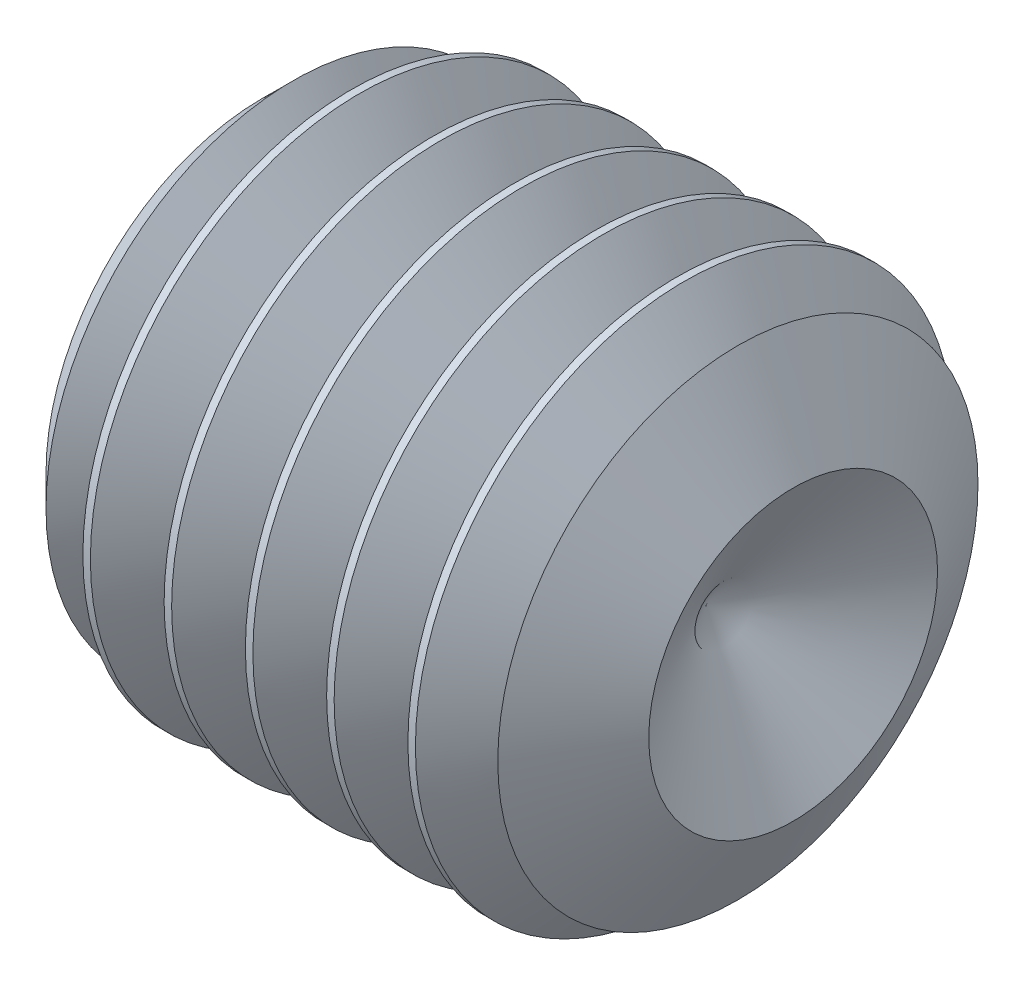
ISO-10303-21;
HEADER;
FILE_DESCRIPTION(('STEP AP214'),'2;1');
FILE_NAME('part.step','',(''),(''),'','','');
FILE_SCHEMA(('AUTOMOTIVE_DESIGN { 1 0 10303 214 1 1 1 1 }'));
ENDSEC;
DATA;
#1=APPLICATION_CONTEXT('core data for automotive mechanical design processes');
#2=APPLICATION_PROTOCOL_DEFINITION('international standard','automotive_design',2000,#1);
#3=PRODUCT_CONTEXT('',#1,'mechanical');
#4=PRODUCT('Part','Part','',(#3));
#5=PRODUCT_RELATED_PRODUCT_CATEGORY('part','',(#4));
#6=PRODUCT_DEFINITION_FORMATION('','',#4);
#7=PRODUCT_DEFINITION_CONTEXT('part definition',#1,'design');
#8=PRODUCT_DEFINITION('design','',#6,#7);
#9=PRODUCT_DEFINITION_SHAPE('','',#8);
#10=(LENGTH_UNIT() NAMED_UNIT(*) SI_UNIT(.MILLI.,.METRE.));
#11=(NAMED_UNIT(*) PLANE_ANGLE_UNIT() SI_UNIT($,.RADIAN.));
#12=(NAMED_UNIT(*) SI_UNIT($,.STERADIAN.) SOLID_ANGLE_UNIT());
#13=UNCERTAINTY_MEASURE_WITH_UNIT(LENGTH_MEASURE(1.E-05),#10,'distance_accuracy_value','');
#14=(GEOMETRIC_REPRESENTATION_CONTEXT(3) GLOBAL_UNCERTAINTY_ASSIGNED_CONTEXT((#13)) GLOBAL_UNIT_ASSIGNED_CONTEXT((#10,
#11,#12)) REPRESENTATION_CONTEXT('',''));
#15=CARTESIAN_POINT('',(0.,0.,0.));
#16=DIRECTION('',(0.,0.,1.));
#17=DIRECTION('',(1.,0.,0.));
#18=AXIS2_PLACEMENT_3D('',#15,#16,#17);
#19=CARTESIAN_POINT('',(4.26675026304796,-1.32671651442706E-11,0.));
#20=DIRECTION('',(-1.,0.,0.));
#21=DIRECTION('',(0.,0.,1.));
#22=AXIS2_PLACEMENT_3D('',#19,#20,#21);
#23=CONICAL_SURFACE('',#22,2.15406373223784,1.0471975511966);
#24=CARTESIAN_POINT('',(4.76249999999673,-1.32671651442706E-11,0.));
#25=DIRECTION('',(-1.,0.,0.));
#26=DIRECTION('',(0.,0.,1.));
#27=AXIS2_PLACEMENT_3D('',#24,#25,#26);
#28=CIRCLE('',#27,1.29540000000361);
#29=CARTESIAN_POINT('',(4.76249999999673,-1.32671651442706E-11,1.29540000000361));
#30=VERTEX_POINT('',#29);
#31=EDGE_CURVE('E135',#30,#30,#28,.T.);
#32=ORIENTED_EDGE('',*,*,#31,.T.);
#33=EDGE_LOOP('',(#32));
#34=FACE_BOUND('',#33,.T.);
#35=CARTESIAN_POINT('',(4.26675026304796,-1.32671651442706E-11,0.));
#36=DIRECTION('',(-1.,0.,0.));
#37=DIRECTION('',(0.,0.,1.));
#38=AXIS2_PLACEMENT_3D('',#35,#36,#37);
#39=CIRCLE('',#38,2.15406373223784);
#40=CARTESIAN_POINT('',(4.26675026304796,-1.32671651442706E-11,2.15406373223784));
#41=VERTEX_POINT('',#40);
#42=EDGE_CURVE('E11',#41,#41,#39,.T.);
#43=ORIENTED_EDGE('',*,*,#42,.F.);
#44=EDGE_LOOP('',(#43));
#45=FACE_BOUND('',#44,.T.);
#46=ADVANCED_FACE('F36',(#34,#45),#23,.T.);
#47=CARTESIAN_POINT('',(4.11725334026869,-1.32671651442706E-11,0.));
#48=DIRECTION('',(1.,0.,0.));
#49=DIRECTION('',(0.,0.,-1.));
#50=AXIS2_PLACEMENT_3D('',#47,#48,#49);
#51=CONICAL_SURFACE('',#50,1.94055999988573,0.959931088752909);
#52=ORIENTED_EDGE('',*,*,#42,.T.);
#53=EDGE_LOOP('',(#52));
#54=FACE_BOUND('',#53,.T.);
#55=CARTESIAN_POINT('',(4.11725334026869,-1.32671651442706E-11,0.));
#56=DIRECTION('',(-1.,0.,0.));
#57=DIRECTION('',(0.,0.,1.));
#58=AXIS2_PLACEMENT_3D('',#55,#56,#57);
#59=CIRCLE('',#58,1.94055999988573);
#60=CARTESIAN_POINT('',(4.11725334026869,-1.32671651442706E-11,1.94055999988573));
#61=VERTEX_POINT('',#60);
#62=EDGE_CURVE('E43',#61,#61,#59,.T.);
#63=ORIENTED_EDGE('',*,*,#62,.F.);
#64=EDGE_LOOP('',(#63));
#65=FACE_BOUND('',#64,.T.);
#66=ADVANCED_FACE('F201',(#54,#65),#51,.T.);
#67=CARTESIAN_POINT('',(3.78644729093766,-1.32671651442706E-11,0.));
#68=DIRECTION('',(-1.,0.,0.));
#69=DIRECTION('',(0.,0.,1.));
#70=AXIS2_PLACEMENT_3D('',#67,#68,#69);
#71=CONICAL_SURFACE('',#70,2.41300000000325,0.959931088743223);
#72=ORIENTED_EDGE('',*,*,#62,.T.);
#73=EDGE_LOOP('',(#72));
#74=FACE_BOUND('',#73,.T.);
#75=CARTESIAN_POINT('',(3.78644729093766,-1.32671651442706E-11,0.));
#76=DIRECTION('',(-1.,0.,0.));
#77=DIRECTION('',(0.,0.,1.));
#78=AXIS2_PLACEMENT_3D('',#75,#76,#77);
#79=CIRCLE('',#78,2.41300000000325);
#80=CARTESIAN_POINT('',(3.78644729093766,-1.32671651442706E-11,2.41300000000325));
#81=VERTEX_POINT('',#80);
#82=EDGE_CURVE('E193',#81,#81,#79,.T.);
#83=ORIENTED_EDGE('',*,*,#82,.F.);
#84=EDGE_LOOP('',(#83));
#85=FACE_BOUND('',#84,.T.);
#86=ADVANCED_FACE('F198',(#74,#85),#71,.T.);
#87=CARTESIAN_POINT('',(4.76252500002106,-1.32671651442706E-11,0.));
#88=DIRECTION('',(-1.,0.,0.));
#89=DIRECTION('',(0.,0.,1.));
#90=AXIS2_PLACEMENT_3D('',#87,#88,#89);
#91=CYLINDRICAL_SURFACE('',#90,2.41300000000325);
#92=ORIENTED_EDGE('',*,*,#82,.T.);
#93=EDGE_LOOP('',(#92));
#94=FACE_BOUND('',#93,.T.);
#95=CARTESIAN_POINT('',(3.71909672156789,-1.32671651442706E-11,0.));
#96=DIRECTION('',(-1.,0.,0.));
#97=DIRECTION('',(0.,0.,1.));
#98=AXIS2_PLACEMENT_3D('',#95,#96,#97);
#99=CIRCLE('',#98,2.41300000000325);
#100=CARTESIAN_POINT('',(3.71909672156789,-1.32671651442706E-11,2.41300000000325));
#101=VERTEX_POINT('',#100);
#102=EDGE_CURVE('E190',#101,#101,#99,.T.);
#103=ORIENTED_EDGE('',*,*,#102,.F.);
#104=EDGE_LOOP('',(#103));
#105=FACE_BOUND('',#104,.T.);
#106=ADVANCED_FACE('F208',(#94,#105),#91,.T.);
#107=CARTESIAN_POINT('',(3.38829067226243,-1.32671651442706E-11,0.));
#108=DIRECTION('',(1.,0.,0.));
#109=DIRECTION('',(0.,0.,-1.));
#110=AXIS2_PLACEMENT_3D('',#107,#108,#109);
#111=CONICAL_SURFACE('',#110,1.94055999992823,0.959931088737295);
#112=ORIENTED_EDGE('',*,*,#102,.T.);
#113=EDGE_LOOP('',(#112));
#114=FACE_BOUND('',#113,.T.);
#115=CARTESIAN_POINT('',(3.38829067226243,-1.32671651442706E-11,0.));
#116=DIRECTION('',(-1.,0.,0.));
#117=DIRECTION('',(0.,0.,1.));
#118=AXIS2_PLACEMENT_3D('',#115,#116,#117);
#119=CIRCLE('',#118,1.94055999992823);
#120=CARTESIAN_POINT('',(3.38829067226243,-1.32671651442706E-11,1.94055999992823));
#121=VERTEX_POINT('',#120);
#122=EDGE_CURVE('E187',#121,#121,#119,.T.);
#123=ORIENTED_EDGE('',*,*,#122,.F.);
#124=EDGE_LOOP('',(#123));
#125=FACE_BOUND('',#124,.T.);
#126=ADVANCED_FACE('F214',(#114,#125),#111,.T.);
#127=CARTESIAN_POINT('',(3.05748462287977,-1.32671651442706E-11,0.));
#128=DIRECTION('',(-1.,0.,0.));
#129=DIRECTION('',(0.,0.,1.));
#130=AXIS2_PLACEMENT_3D('',#127,#128,#129);
#131=CONICAL_SURFACE('',#130,2.41300000000325,0.959931088627634);
#132=ORIENTED_EDGE('',*,*,#122,.T.);
#133=EDGE_LOOP('',(#132));
#134=FACE_BOUND('',#133,.T.);
#135=CARTESIAN_POINT('',(3.05748462287977,-1.32671651442706E-11,0.));
#136=DIRECTION('',(-1.,0.,0.));
#137=DIRECTION('',(0.,0.,1.));
#138=AXIS2_PLACEMENT_3D('',#135,#136,#137);
#139=CIRCLE('',#138,2.41300000000325);
#140=CARTESIAN_POINT('',(3.05748462287977,-1.32671651442706E-11,2.41300000000325));
#141=VERTEX_POINT('',#140);
#142=EDGE_CURVE('E184',#141,#141,#139,.T.);
#143=ORIENTED_EDGE('',*,*,#142,.F.);
#144=EDGE_LOOP('',(#143));
#145=FACE_BOUND('',#144,.T.);
#146=ADVANCED_FACE('F218',(#134,#145),#131,.T.);
#147=CARTESIAN_POINT('',(4.76252500002106,-1.32671651442706E-11,0.));
#148=DIRECTION('',(-1.,0.,0.));
#149=DIRECTION('',(0.,0.,1.));
#150=AXIS2_PLACEMENT_3D('',#147,#148,#149);
#151=CYLINDRICAL_SURFACE('',#150,2.41300000000325);
#152=ORIENTED_EDGE('',*,*,#142,.T.);
#153=EDGE_LOOP('',(#152));
#154=FACE_BOUND('',#153,.T.);
#155=CARTESIAN_POINT('',(2.99013405356163,-1.32671651442706E-11,0.));
#156=DIRECTION('',(-1.,0.,0.));
#157=DIRECTION('',(0.,0.,1.));
#158=AXIS2_PLACEMENT_3D('',#155,#156,#157);
#159=CIRCLE('',#158,2.41300000000325);
#160=CARTESIAN_POINT('',(2.99013405356163,-1.32671651442706E-11,2.41300000000325));
#161=VERTEX_POINT('',#160);
#162=EDGE_CURVE('E181',#161,#161,#159,.T.);
#163=ORIENTED_EDGE('',*,*,#162,.F.);
#164=EDGE_LOOP('',(#163));
#165=FACE_BOUND('',#164,.T.);
#166=ADVANCED_FACE('F222',(#154,#165),#151,.T.);
#167=CARTESIAN_POINT('',(2.65932800419932,-1.32671651442706E-11,0.));
#168=DIRECTION('',(1.,0.,0.));
#169=DIRECTION('',(0.,0.,-1.));
#170=AXIS2_PLACEMENT_3D('',#167,#168,#169);
#171=CONICAL_SURFACE('',#170,1.94056000001758,0.959931088567702);
#172=ORIENTED_EDGE('',*,*,#162,.T.);
#173=EDGE_LOOP('',(#172));
#174=FACE_BOUND('',#173,.T.);
#175=CARTESIAN_POINT('',(2.65932800419932,-1.32671651442706E-11,0.));
#176=DIRECTION('',(-1.,0.,0.));
#177=DIRECTION('',(0.,0.,1.));
#178=AXIS2_PLACEMENT_3D('',#175,#176,#177);
#179=CIRCLE('',#178,1.94056000001758);
#180=CARTESIAN_POINT('',(2.65932800419932,-1.32671651442706E-11,1.94056000001758));
#181=VERTEX_POINT('',#180);
#182=EDGE_CURVE('E178',#181,#181,#179,.T.);
#183=ORIENTED_EDGE('',*,*,#182,.F.);
#184=EDGE_LOOP('',(#183));
#185=FACE_BOUND('',#184,.T.);
#186=ADVANCED_FACE('F226',(#174,#185),#171,.T.);
#187=CARTESIAN_POINT('',(2.32852195482186,-1.32671651442706E-11,0.));
#188=DIRECTION('',(-1.,0.,0.));
#189=DIRECTION('',(0.,0.,1.));
#190=AXIS2_PLACEMENT_3D('',#187,#188,#189);
#191=CONICAL_SURFACE('',#190,2.41300000000325,0.959931088546185);
#192=ORIENTED_EDGE('',*,*,#182,.T.);
#193=EDGE_LOOP('',(#192));
#194=FACE_BOUND('',#193,.T.);
#195=CARTESIAN_POINT('',(2.32852195482186,-1.32671651442706E-11,0.));
#196=DIRECTION('',(-1.,0.,0.));
#197=DIRECTION('',(0.,0.,1.));
#198=AXIS2_PLACEMENT_3D('',#195,#196,#197);
#199=CIRCLE('',#198,2.41300000000325);
#200=CARTESIAN_POINT('',(2.32852195482186,-1.32671651442706E-11,2.41300000000325));
#201=VERTEX_POINT('',#200);
#202=EDGE_CURVE('E175',#201,#201,#199,.T.);
#203=ORIENTED_EDGE('',*,*,#202,.F.);
#204=EDGE_LOOP('',(#203));
#205=FACE_BOUND('',#204,.T.);
#206=ADVANCED_FACE('F230',(#194,#205),#191,.T.);
#207=CARTESIAN_POINT('',(4.76252500002106,-1.32671651442706E-11,0.));
#208=DIRECTION('',(-1.,0.,0.));
#209=DIRECTION('',(0.,0.,1.));
#210=AXIS2_PLACEMENT_3D('',#207,#208,#209);
#211=CYLINDRICAL_SURFACE('',#210,2.41300000000325);
#212=ORIENTED_EDGE('',*,*,#202,.T.);
#213=EDGE_LOOP('',(#212));
#214=FACE_BOUND('',#213,.T.);
#215=CARTESIAN_POINT('',(2.26117138549853,-1.32671651442706E-11,0.));
#216=DIRECTION('',(-1.,0.,0.));
#217=DIRECTION('',(0.,0.,1.));
#218=AXIS2_PLACEMENT_3D('',#215,#216,#217);
#219=CIRCLE('',#218,2.41300000000325);
#220=CARTESIAN_POINT('',(2.26117138549853,-1.32671651442706E-11,2.41300000000325));
#221=VERTEX_POINT('',#220);
#222=EDGE_CURVE('E172',#221,#221,#219,.T.);
#223=ORIENTED_EDGE('',*,*,#222,.F.);
#224=EDGE_LOOP('',(#223));
#225=FACE_BOUND('',#224,.T.);
#226=ADVANCED_FACE('F234',(#214,#225),#211,.T.);
#227=CARTESIAN_POINT('',(1.93036533613622,-1.32671651442706E-11,0.));
#228=DIRECTION('',(1.,0.,0.));
#229=DIRECTION('',(0.,0.,-1.));
#230=AXIS2_PLACEMENT_3D('',#227,#228,#229);
#231=CONICAL_SURFACE('',#230,1.94055999999324,0.959931088591904);
#232=ORIENTED_EDGE('',*,*,#222,.T.);
#233=EDGE_LOOP('',(#232));
#234=FACE_BOUND('',#233,.T.);
#235=CARTESIAN_POINT('',(1.93036533613622,-1.32671651442706E-11,0.));
#236=DIRECTION('',(-1.,0.,0.));
#237=DIRECTION('',(0.,0.,1.));
#238=AXIS2_PLACEMENT_3D('',#235,#236,#237);
#239=CIRCLE('',#238,1.94055999999324);
#240=CARTESIAN_POINT('',(1.93036533613622,-1.32671651442706E-11,1.94055999999324));
#241=VERTEX_POINT('',#240);
#242=EDGE_CURVE('E169',#241,#241,#239,.T.);
#243=ORIENTED_EDGE('',*,*,#242,.F.);
#244=EDGE_LOOP('',(#243));
#245=FACE_BOUND('',#244,.T.);
#246=ADVANCED_FACE('F238',(#234,#245),#231,.T.);
#247=CARTESIAN_POINT('',(1.59955928676397,-1.32671651442706E-11,0.));
#248=DIRECTION('',(-1.,0.,0.));
#249=DIRECTION('',(0.,0.,1.));
#250=AXIS2_PLACEMENT_3D('',#247,#248,#249);
#251=CONICAL_SURFACE('',#250,2.41300000000325,0.959931088577797);
#252=ORIENTED_EDGE('',*,*,#242,.T.);
#253=EDGE_LOOP('',(#252));
#254=FACE_BOUND('',#253,.T.);
#255=CARTESIAN_POINT('',(1.59955928676397,-1.32671651442706E-11,0.));
#256=DIRECTION('',(-1.,0.,0.));
#257=DIRECTION('',(0.,0.,1.));
#258=AXIS2_PLACEMENT_3D('',#255,#256,#257);
#259=CIRCLE('',#258,2.41300000000325);
#260=CARTESIAN_POINT('',(1.59955928676397,-1.32671651442706E-11,2.41300000000325));
#261=VERTEX_POINT('',#260);
#262=EDGE_CURVE('E166',#261,#261,#259,.T.);
#263=ORIENTED_EDGE('',*,*,#262,.F.);
#264=EDGE_LOOP('',(#263));
#265=FACE_BOUND('',#264,.T.);
#266=ADVANCED_FACE('F242',(#254,#265),#251,.T.);
#267=CARTESIAN_POINT('',(4.76252500002106,-1.32671651442706E-11,0.));
#268=DIRECTION('',(-1.,0.,0.));
#269=DIRECTION('',(0.,0.,1.));
#270=AXIS2_PLACEMENT_3D('',#267,#268,#269);
#271=CYLINDRICAL_SURFACE('',#270,2.41300000000325);
#272=ORIENTED_EDGE('',*,*,#262,.T.);
#273=EDGE_LOOP('',(#272));
#274=FACE_BOUND('',#273,.T.);
#275=CARTESIAN_POINT('',(1.53220871751503,-1.32671651442706E-11,0.));
#276=DIRECTION('',(-1.,0.,0.));
#277=DIRECTION('',(0.,0.,1.));
#278=AXIS2_PLACEMENT_3D('',#275,#276,#277);
#279=CIRCLE('',#278,2.41300000000325);
#280=CARTESIAN_POINT('',(1.53220871751503,-1.32671651442706E-11,2.41300000000325));
#281=VERTEX_POINT('',#280);
#282=EDGE_CURVE('E163',#281,#281,#279,.T.);
#283=ORIENTED_EDGE('',*,*,#282,.F.);
#284=EDGE_LOOP('',(#283));
#285=FACE_BOUND('',#284,.T.);
#286=ADVANCED_FACE('F246',(#274,#285),#271,.T.);
#287=CARTESIAN_POINT('',(1.20140266807311,-1.32671651442706E-11,0.));
#288=DIRECTION('',(1.,0.,0.));
#289=DIRECTION('',(0.,0.,-1.));
#290=AXIS2_PLACEMENT_3D('',#287,#288,#289);
#291=CONICAL_SURFACE('',#290,1.9405599999364,0.959931088535373);
#292=ORIENTED_EDGE('',*,*,#282,.T.);
#293=EDGE_LOOP('',(#292));
#294=FACE_BOUND('',#293,.T.);
#295=CARTESIAN_POINT('',(1.20140266807311,-1.32671651442706E-11,0.));
#296=DIRECTION('',(-1.,0.,0.));
#297=DIRECTION('',(0.,0.,1.));
#298=AXIS2_PLACEMENT_3D('',#295,#296,#297);
#299=CIRCLE('',#298,1.9405599999364);
#300=CARTESIAN_POINT('',(1.20140266807311,-1.32671651442706E-11,1.9405599999364));
#301=VERTEX_POINT('',#300);
#302=EDGE_CURVE('E160',#301,#301,#299,.T.);
#303=ORIENTED_EDGE('',*,*,#302,.F.);
#304=EDGE_LOOP('',(#303));
#305=FACE_BOUND('',#304,.T.);
#306=ADVANCED_FACE('F250',(#294,#305),#291,.T.);
#307=CARTESIAN_POINT('',(0.870596618706088,-1.32671651442706E-11,0.));
#308=DIRECTION('',(-1.,0.,0.));
#309=DIRECTION('',(0.,0.,1.));
#310=AXIS2_PLACEMENT_3D('',#307,#308,#309);
#311=CONICAL_SURFACE('',#310,2.41300000000325,0.95993108864174);
#312=ORIENTED_EDGE('',*,*,#302,.T.);
#313=EDGE_LOOP('',(#312));
#314=FACE_BOUND('',#313,.T.);
#315=CARTESIAN_POINT('',(0.870596618706088,-1.32671651442706E-11,0.));
#316=DIRECTION('',(-1.,0.,0.));
#317=DIRECTION('',(0.,0.,1.));
#318=AXIS2_PLACEMENT_3D('',#315,#316,#317);
#319=CIRCLE('',#318,2.41300000000325);
#320=CARTESIAN_POINT('',(0.870596618706088,-1.32671651442706E-11,2.41300000000325));
#321=VERTEX_POINT('',#320);
#322=EDGE_CURVE('E157',#321,#321,#319,.T.);
#323=ORIENTED_EDGE('',*,*,#322,.F.);
#324=EDGE_LOOP('',(#323));
#325=FACE_BOUND('',#324,.T.);
#326=ADVANCED_FACE('F254',(#314,#325),#311,.T.);
#327=CARTESIAN_POINT('',(4.76252500002106,-1.32671651442706E-11,0.));
#328=DIRECTION('',(-1.,0.,0.));
#329=DIRECTION('',(0.,0.,1.));
#330=AXIS2_PLACEMENT_3D('',#327,#328,#329);
#331=CYLINDRICAL_SURFACE('',#330,2.41300000000325);
#332=ORIENTED_EDGE('',*,*,#322,.T.);
#333=EDGE_LOOP('',(#332));
#334=FACE_BOUND('',#333,.T.);
#335=CARTESIAN_POINT('',(0.803246049451922,-1.32671651442706E-11,0.));
#336=DIRECTION('',(-1.,0.,0.));
#337=DIRECTION('',(0.,0.,1.));
#338=AXIS2_PLACEMENT_3D('',#335,#336,#337);
#339=CIRCLE('',#338,2.41300000000325);
#340=CARTESIAN_POINT('',(0.803246049451922,-1.32671651442706E-11,2.41300000000325));
#341=VERTEX_POINT('',#340);
#342=EDGE_CURVE('E154',#341,#341,#339,.T.);
#343=ORIENTED_EDGE('',*,*,#342,.F.);
#344=EDGE_LOOP('',(#343));
#345=FACE_BOUND('',#344,.T.);
#346=ADVANCED_FACE('F258',(#334,#345),#331,.T.);
#347=CARTESIAN_POINT('',(0.47244000001001,-1.32671651442706E-11,0.));
#348=DIRECTION('',(1.,0.,0.));
#349=DIRECTION('',(0.,0.,-1.));
#350=AXIS2_PLACEMENT_3D('',#347,#348,#349);
#351=CONICAL_SURFACE('',#350,1.94055999996074,0.959931088511169);
#352=ORIENTED_EDGE('',*,*,#342,.T.);
#353=EDGE_LOOP('',(#352));
#354=FACE_BOUND('',#353,.T.);
#355=CARTESIAN_POINT('',(0.47244000001001,-1.32671651442706E-11,0.));
#356=DIRECTION('',(-1.,0.,0.));
#357=DIRECTION('',(0.,0.,1.));
#358=AXIS2_PLACEMENT_3D('',#355,#356,#357);
#359=CIRCLE('',#358,1.94055999996074);
#360=CARTESIAN_POINT('',(0.47244000001001,-1.32671651442706E-11,1.94055999996074));
#361=VERTEX_POINT('',#360);
#362=EDGE_CURVE('E151',#361,#361,#359,.T.);
#363=ORIENTED_EDGE('',*,*,#362,.F.);
#364=EDGE_LOOP('',(#363));
#365=FACE_BOUND('',#364,.T.);
#366=ADVANCED_FACE('F262',(#354,#365),#351,.T.);
#367=CARTESIAN_POINT('',(0.277871959383447,-1.32671651442706E-11,0.));
#368=DIRECTION('',(-1.,0.,0.));
#369=DIRECTION('',(0.,0.,1.));
#370=AXIS2_PLACEMENT_3D('',#367,#368,#369);
#371=CONICAL_SURFACE('',#370,2.21843195931985,0.959931088533581);
#372=ORIENTED_EDGE('',*,*,#362,.T.);
#373=EDGE_LOOP('',(#372));
#374=FACE_BOUND('',#373,.T.);
#375=CARTESIAN_POINT('',(0.277871959383447,-1.32671651442706E-11,0.));
#376=DIRECTION('',(-1.,0.,0.));
#377=DIRECTION('',(0.,0.,1.));
#378=AXIS2_PLACEMENT_3D('',#375,#376,#377);
#379=CIRCLE('',#378,2.21843195931985);
#380=CARTESIAN_POINT('',(0.277871959383447,-1.32671651442706E-11,2.21843195931985));
#381=VERTEX_POINT('',#380);
#382=EDGE_CURVE('E148',#381,#381,#379,.T.);
#383=ORIENTED_EDGE('',*,*,#382,.F.);
#384=EDGE_LOOP('',(#383));
#385=FACE_BOUND('',#384,.T.);
#386=ADVANCED_FACE('F266',(#374,#385),#371,.T.);
#387=CARTESIAN_POINT('',(0.,-1.32671651442706E-11,0.));
#388=DIRECTION('',(1.,0.,0.));
#389=DIRECTION('',(0.,0.,-1.));
#390=AXIS2_PLACEMENT_3D('',#387,#388,#389);
#391=CONICAL_SURFACE('',#390,1.9405599999364,0.785398163397448);
#392=ORIENTED_EDGE('',*,*,#382,.T.);
#393=EDGE_LOOP('',(#392));
#394=FACE_BOUND('',#393,.T.);
#395=CARTESIAN_POINT('',(0.,-1.32671651442706E-11,0.));
#396=DIRECTION('',(-1.,0.,0.));
#397=DIRECTION('',(0.,0.,1.));
#398=AXIS2_PLACEMENT_3D('',#395,#396,#397);
#399=CIRCLE('',#398,1.9405599999364);
#400=CARTESIAN_POINT('',(0.,-1.32671651442706E-11,1.9405599999364));
#401=VERTEX_POINT('',#400);
#402=EDGE_CURVE('E145',#401,#401,#399,.T.);
#403=ORIENTED_EDGE('',*,*,#402,.F.);
#404=EDGE_LOOP('',(#403));
#405=FACE_BOUND('',#404,.T.);
#406=ADVANCED_FACE('F270',(#394,#405),#391,.T.);
#407=CARTESIAN_POINT('',(0.,-1.32671651442706E-11,0.));
#408=DIRECTION('',(-1.,0.,0.));
#409=DIRECTION('',(0.,0.,1.));
#410=AXIS2_PLACEMENT_3D('',#407,#408,#409);
#411=PLANE('',#410);
#412=DIRECTION('',(0.,0.866025403784439,0.5));
#413=VECTOR('',#412,1.);
#414=CARTESIAN_POINT('',(0.,-1.18998999999997,0.687041046832967));
#415=LINE('',#414,#413);
#416=CARTESIAN_POINT('',(0.,-1.18998999999997,0.687041046832967));
#417=VERTEX_POINT('',#416);
#418=CARTESIAN_POINT('',(0.,0.,1.37408209366592));
#419=VERTEX_POINT('',#418);
#420=EDGE_CURVE('E50',#417,#419,#415,.T.);
#421=ORIENTED_EDGE('',*,*,#420,.F.);
#422=DIRECTION('',(0.,0.,1.));
#423=VECTOR('',#422,1.);
#424=CARTESIAN_POINT('',(0.,-1.18998999999997,-0.687041046832967));
#425=LINE('',#424,#423);
#426=CARTESIAN_POINT('',(0.,-1.18998999999997,-0.687041046832967));
#427=VERTEX_POINT('',#426);
#428=EDGE_CURVE('E109',#427,#417,#425,.T.);
#429=ORIENTED_EDGE('',*,*,#428,.F.);
#430=DIRECTION('',(0.,-0.86602540378444,0.499999999999998));
#431=VECTOR('',#430,1.);
#432=CARTESIAN_POINT('',(0.,0.,-1.37408209366592));
#433=LINE('',#432,#431);
#434=CARTESIAN_POINT('',(0.,0.,-1.37408209366592));
#435=VERTEX_POINT('',#434);
#436=EDGE_CURVE('E112',#435,#427,#433,.T.);
#437=ORIENTED_EDGE('',*,*,#436,.F.);
#438=DIRECTION('',(0.,-0.866025403784439,-0.5));
#439=VECTOR('',#438,1.);
#440=CARTESIAN_POINT('',(0.,1.18999000000003,-0.687041046832967));
#441=LINE('',#440,#439);
#442=CARTESIAN_POINT('',(0.,1.18999000000003,-0.687041046832967));
#443=VERTEX_POINT('',#442);
#444=EDGE_CURVE('E128',#443,#435,#441,.T.);
#445=ORIENTED_EDGE('',*,*,#444,.F.);
#446=DIRECTION('',(0.,0.,-1.));
#447=VECTOR('',#446,1.);
#448=CARTESIAN_POINT('',(0.,1.18999000000003,0.687041046832967));
#449=LINE('',#448,#447);
#450=CARTESIAN_POINT('',(0.,1.18999000000003,0.687041046832967));
#451=VERTEX_POINT('',#450);
#452=EDGE_CURVE('E125',#451,#443,#449,.T.);
#453=ORIENTED_EDGE('',*,*,#452,.F.);
#454=DIRECTION('',(0.,0.86602540378444,-0.499999999999998));
#455=VECTOR('',#454,1.);
#456=CARTESIAN_POINT('',(0.,0.,1.37408209366592));
#457=LINE('',#456,#455);
#458=EDGE_CURVE('E123',#419,#451,#457,.T.);
#459=ORIENTED_EDGE('',*,*,#458,.F.);
#460=EDGE_LOOP('',(#421,#429,#437,#445,#453,#459));
#461=FACE_BOUND('',#460,.T.);
#462=ORIENTED_EDGE('',*,*,#402,.T.);
#463=EDGE_LOOP('',(#462));
#464=FACE_BOUND('',#463,.T.);
#465=ADVANCED_FACE('F274',(#461,#464),#411,.T.);
#466=CARTESIAN_POINT('',(4.76249999999673,-1.32671651442706E-11,0.));
#467=DIRECTION('',(1.,0.,0.));
#468=DIRECTION('',(0.,0.,-1.));
#469=AXIS2_PLACEMENT_3D('',#466,#467,#468);
#470=CONICAL_SURFACE('',#469,1.29540000000361,1.02974425867636);
#471=CARTESIAN_POINT('',(3.9841451541057,-1.32671651442706E-11,0.));
#472=VERTEX_POINT('',#471);
#473=VERTEX_LOOP('',#472);
#474=FACE_BOUND('',#473,.T.);
#475=ORIENTED_EDGE('',*,*,#31,.F.);
#476=EDGE_LOOP('',(#475));
#477=FACE_BOUND('',#476,.T.);
#478=ADVANCED_FACE('F278',(#474,#477),#470,.F.);
#479=CARTESIAN_POINT('',(2.54000000000001,-1.18998999999997,0.687041046832967));
#480=DIRECTION('',(0.,-0.5,0.866025403784439));
#481=DIRECTION('',(0.,-0.866025403784439,-0.5));
#482=AXIS2_PLACEMENT_3D('',#479,#480,#481);
#483=PLANE('',#482);
#484=ORIENTED_EDGE('',*,*,#420,.T.);
#485=DIRECTION('',(-1.,0.,0.));
#486=VECTOR('',#485,1.);
#487=CARTESIAN_POINT('',(2.54000000000001,0.,1.37408209366592));
#488=LINE('',#487,#486);
#489=CARTESIAN_POINT('',(2.54000000000001,0.,1.37408209366592));
#490=VERTEX_POINT('',#489);
#491=EDGE_CURVE('E86',#490,#419,#488,.T.);
#492=ORIENTED_EDGE('',*,*,#491,.F.);
#493=DIRECTION('',(0.,0.866025403784439,0.5));
#494=VECTOR('',#493,1.);
#495=CARTESIAN_POINT('',(2.54000000000001,-1.18998999999997,0.687041046832967));
#496=LINE('',#495,#494);
#497=CARTESIAN_POINT('',(2.54000000000001,-1.18998999999997,0.687041046832967));
#498=VERTEX_POINT('',#497);
#499=EDGE_CURVE('E90',#498,#490,#496,.T.);
#500=ORIENTED_EDGE('',*,*,#499,.F.);
#501=DIRECTION('',(-1.,0.,0.));
#502=VECTOR('',#501,1.);
#503=CARTESIAN_POINT('',(2.54000000000001,-1.18998999999997,0.687041046832967));
#504=LINE('',#503,#502);
#505=EDGE_CURVE('E133',#498,#417,#504,.T.);
#506=ORIENTED_EDGE('',*,*,#505,.T.);
#507=EDGE_LOOP('',(#484,#492,#500,#506));
#508=FACE_BOUND('',#507,.T.);
#509=ADVANCED_FACE('F88',(#508),#483,.F.);
#510=CARTESIAN_POINT('',(2.54000000000001,-1.18998999999997,-0.687041046832967));
#511=DIRECTION('',(0.,-1.,0.));
#512=DIRECTION('',(0.,0.,-1.));
#513=AXIS2_PLACEMENT_3D('',#510,#511,#512);
#514=PLANE('',#513);
#515=ORIENTED_EDGE('',*,*,#428,.T.);
#516=ORIENTED_EDGE('',*,*,#505,.F.);
#517=DIRECTION('',(0.,0.,1.));
#518=VECTOR('',#517,1.);
#519=CARTESIAN_POINT('',(2.54000000000001,-1.18998999999997,-0.687041046832967));
#520=LINE('',#519,#518);
#521=CARTESIAN_POINT('',(2.54000000000001,-1.18998999999997,-0.687041046832967));
#522=VERTEX_POINT('',#521);
#523=EDGE_CURVE('E96',#522,#498,#520,.T.);
#524=ORIENTED_EDGE('',*,*,#523,.F.);
#525=DIRECTION('',(-1.,0.,0.));
#526=VECTOR('',#525,1.);
#527=CARTESIAN_POINT('',(2.54000000000001,-1.18998999999997,-0.687041046832967));
#528=LINE('',#527,#526);
#529=EDGE_CURVE('E136',#522,#427,#528,.T.);
#530=ORIENTED_EDGE('',*,*,#529,.T.);
#531=EDGE_LOOP('',(#515,#516,#524,#530));
#532=FACE_BOUND('',#531,.T.);
#533=ADVANCED_FACE('F284',(#532),#514,.F.);
#534=CARTESIAN_POINT('',(2.54000000000001,0.,-1.37408209366592));
#535=DIRECTION('',(0.,-0.499999999999998,-0.86602540378444));
#536=DIRECTION('',(0.,0.86602540378444,-0.499999999999998));
#537=AXIS2_PLACEMENT_3D('',#534,#535,#536);
#538=PLANE('',#537);
#539=ORIENTED_EDGE('',*,*,#436,.T.);
#540=ORIENTED_EDGE('',*,*,#529,.F.);
#541=DIRECTION('',(0.,-0.86602540378444,0.499999999999998));
#542=VECTOR('',#541,1.);
#543=CARTESIAN_POINT('',(2.54000000000001,0.,-1.37408209366592));
#544=LINE('',#543,#542);
#545=CARTESIAN_POINT('',(2.54000000000001,0.,-1.37408209366592));
#546=VERTEX_POINT('',#545);
#547=EDGE_CURVE('E119',#546,#522,#544,.T.);
#548=ORIENTED_EDGE('',*,*,#547,.F.);
#549=DIRECTION('',(-1.,0.,0.));
#550=VECTOR('',#549,1.);
#551=CARTESIAN_POINT('',(2.54000000000001,0.,-1.37408209366592));
#552=LINE('',#551,#550);
#553=EDGE_CURVE('E138',#546,#435,#552,.T.);
#554=ORIENTED_EDGE('',*,*,#553,.T.);
#555=EDGE_LOOP('',(#539,#540,#548,#554));
#556=FACE_BOUND('',#555,.T.);
#557=ADVANCED_FACE('F294',(#556),#538,.F.);
#558=CARTESIAN_POINT('',(2.54000000000001,1.18999000000003,-0.687041046832967));
#559=DIRECTION('',(0.,0.5,-0.866025403784439));
#560=DIRECTION('',(0.,0.866025403784439,0.5));
#561=AXIS2_PLACEMENT_3D('',#558,#559,#560);
#562=PLANE('',#561);
#563=ORIENTED_EDGE('',*,*,#444,.T.);
#564=ORIENTED_EDGE('',*,*,#553,.F.);
#565=DIRECTION('',(0.,-0.866025403784439,-0.5));
#566=VECTOR('',#565,1.);
#567=CARTESIAN_POINT('',(2.54000000000001,1.18999000000003,-0.687041046832967));
#568=LINE('',#567,#566);
#569=CARTESIAN_POINT('',(2.54000000000001,1.18999000000003,-0.687041046832967));
#570=VERTEX_POINT('',#569);
#571=EDGE_CURVE('E116',#570,#546,#568,.T.);
#572=ORIENTED_EDGE('',*,*,#571,.F.);
#573=DIRECTION('',(-1.,0.,0.));
#574=VECTOR('',#573,1.);
#575=CARTESIAN_POINT('',(2.54000000000001,1.18999000000003,-0.687041046832967));
#576=LINE('',#575,#574);
#577=EDGE_CURVE('E140',#570,#443,#576,.T.);
#578=ORIENTED_EDGE('',*,*,#577,.T.);
#579=EDGE_LOOP('',(#563,#564,#572,#578));
#580=FACE_BOUND('',#579,.T.);
#581=ADVANCED_FACE('F290',(#580),#562,.F.);
#582=CARTESIAN_POINT('',(2.54000000000001,1.18999000000003,0.687041046832967));
#583=DIRECTION('',(0.,1.,0.));
#584=DIRECTION('',(0.,0.,1.));
#585=AXIS2_PLACEMENT_3D('',#582,#583,#584);
#586=PLANE('',#585);
#587=ORIENTED_EDGE('',*,*,#452,.T.);
#588=ORIENTED_EDGE('',*,*,#577,.F.);
#589=DIRECTION('',(0.,0.,-1.));
#590=VECTOR('',#589,1.);
#591=CARTESIAN_POINT('',(2.54000000000001,1.18999000000003,0.687041046832967));
#592=LINE('',#591,#590);
#593=CARTESIAN_POINT('',(2.54000000000001,1.18999000000003,0.687041046832967));
#594=VERTEX_POINT('',#593);
#595=EDGE_CURVE('E104',#594,#570,#592,.T.);
#596=ORIENTED_EDGE('',*,*,#595,.F.);
#597=DIRECTION('',(-1.,0.,0.));
#598=VECTOR('',#597,1.);
#599=CARTESIAN_POINT('',(2.54000000000001,1.18999000000003,0.687041046832967));
#600=LINE('',#599,#598);
#601=EDGE_CURVE('E95',#594,#451,#600,.T.);
#602=ORIENTED_EDGE('',*,*,#601,.T.);
#603=EDGE_LOOP('',(#587,#588,#596,#602));
#604=FACE_BOUND('',#603,.T.);
#605=ADVANCED_FACE('F287',(#604),#586,.F.);
#606=CARTESIAN_POINT('',(2.54000000000001,0.,1.37408209366592));
#607=DIRECTION('',(0.,0.499999999999998,0.86602540378444));
#608=DIRECTION('',(0.,-0.86602540378444,0.499999999999998));
#609=AXIS2_PLACEMENT_3D('',#606,#607,#608);
#610=PLANE('',#609);
#611=ORIENTED_EDGE('',*,*,#458,.T.);
#612=ORIENTED_EDGE('',*,*,#601,.F.);
#613=DIRECTION('',(0.,0.86602540378444,-0.499999999999998));
#614=VECTOR('',#613,1.);
#615=CARTESIAN_POINT('',(2.54000000000001,0.,1.37408209366592));
#616=LINE('',#615,#614);
#617=EDGE_CURVE('E99',#490,#594,#616,.T.);
#618=ORIENTED_EDGE('',*,*,#617,.F.);
#619=ORIENTED_EDGE('',*,*,#491,.T.);
#620=EDGE_LOOP('',(#611,#612,#618,#619));
#621=FACE_BOUND('',#620,.T.);
#622=ADVANCED_FACE('F100',(#621),#610,.F.);
#623=CARTESIAN_POINT('',(2.54000000000001,0.,0.));
#624=DIRECTION('',(-1.,0.,0.));
#625=DIRECTION('',(0.,0.,1.));
#626=AXIS2_PLACEMENT_3D('',#623,#624,#625);
#627=PLANE('',#626);
#628=ORIENTED_EDGE('',*,*,#499,.T.);
#629=ORIENTED_EDGE('',*,*,#617,.T.);
#630=ORIENTED_EDGE('',*,*,#595,.T.);
#631=ORIENTED_EDGE('',*,*,#571,.T.);
#632=ORIENTED_EDGE('',*,*,#547,.T.);
#633=ORIENTED_EDGE('',*,*,#523,.T.);
#634=EDGE_LOOP('',(#628,#629,#630,#631,#632,#633));
#635=FACE_BOUND('',#634,.T.);
#636=ADVANCED_FACE('F106',(#635),#627,.T.);
#637=CLOSED_SHELL('',(#46,#66,#86,#106,#126,#146,#166,#186,#206,#226,#246,#266,#286,#306,#326,
#346,#366,#386,#406,#465,#478,#509,#533,#557,#581,#605,#622,#636));
#638=MANIFOLD_SOLID_BREP('B2',#637);
#639=ADVANCED_BREP_SHAPE_REPRESENTATION('',(#18,#638),#14);
#640=SHAPE_DEFINITION_REPRESENTATION(#9,#639);
ENDSEC;
END-ISO-10303-21;
